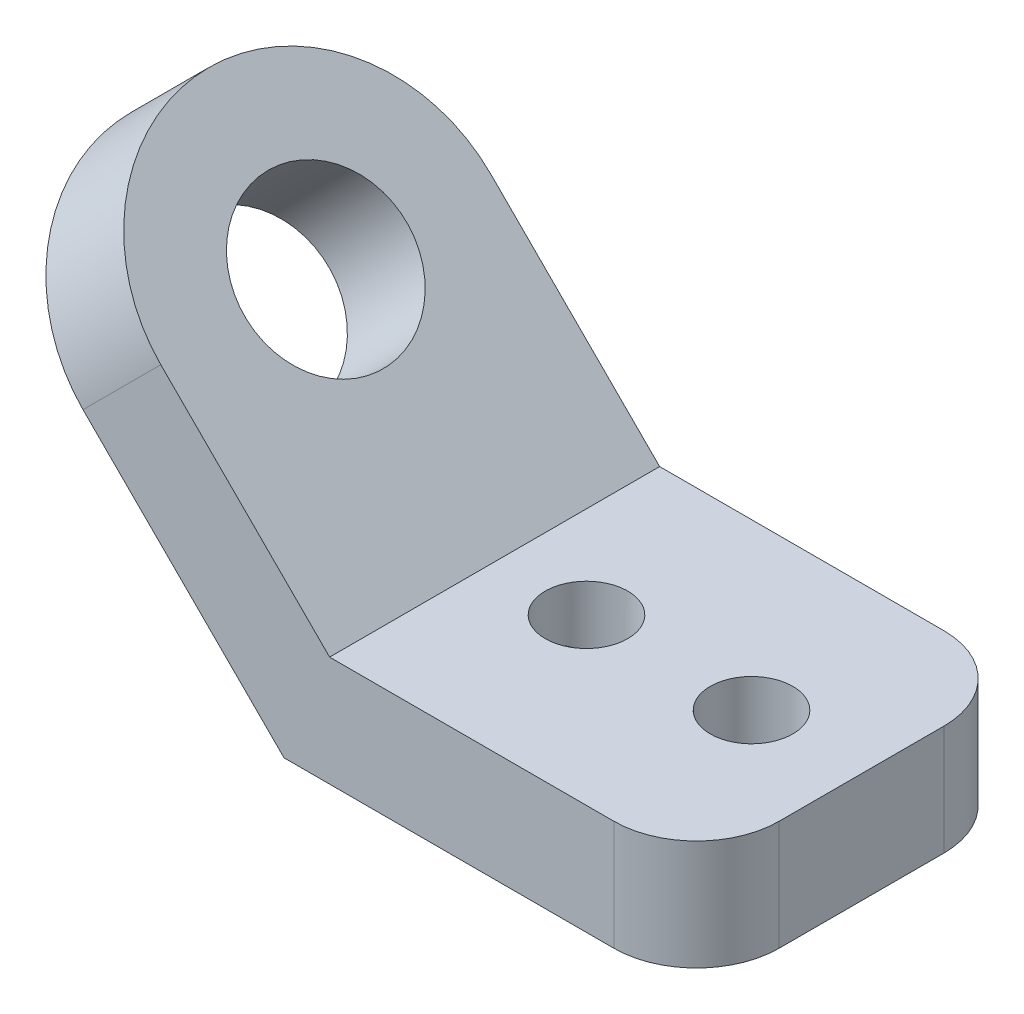
ISO-10303-21;
HEADER;
FILE_DESCRIPTION(('STEP AP214'),'2;1');
FILE_NAME('part.step','',(''),(''),'','','');
FILE_SCHEMA(('AUTOMOTIVE_DESIGN { 1 0 10303 214 1 1 1 1 }'));
ENDSEC;
DATA;
#1=APPLICATION_CONTEXT('core data for automotive mechanical design processes');
#2=APPLICATION_PROTOCOL_DEFINITION('international standard','automotive_design',2000,#1);
#3=PRODUCT_CONTEXT('',#1,'mechanical');
#4=PRODUCT('Part','Part','',(#3));
#5=PRODUCT_RELATED_PRODUCT_CATEGORY('part','',(#4));
#6=PRODUCT_DEFINITION_FORMATION('','',#4);
#7=PRODUCT_DEFINITION_CONTEXT('part definition',#1,'design');
#8=PRODUCT_DEFINITION('design','',#6,#7);
#9=PRODUCT_DEFINITION_SHAPE('','',#8);
#10=(LENGTH_UNIT() NAMED_UNIT(*) SI_UNIT(.MILLI.,.METRE.));
#11=(NAMED_UNIT(*) PLANE_ANGLE_UNIT() SI_UNIT($,.RADIAN.));
#12=(NAMED_UNIT(*) SI_UNIT($,.STERADIAN.) SOLID_ANGLE_UNIT());
#13=UNCERTAINTY_MEASURE_WITH_UNIT(LENGTH_MEASURE(1.E-05),#10,'distance_accuracy_value','');
#14=(GEOMETRIC_REPRESENTATION_CONTEXT(3) GLOBAL_UNCERTAINTY_ASSIGNED_CONTEXT((#13)) GLOBAL_UNIT_ASSIGNED_CONTEXT((#10,
#11,#12)) REPRESENTATION_CONTEXT('',''));
#15=CARTESIAN_POINT('',(0.,0.,0.));
#16=DIRECTION('',(0.,0.,1.));
#17=DIRECTION('',(1.,0.,0.));
#18=AXIS2_PLACEMENT_3D('',#15,#16,#17);
#19=CARTESIAN_POINT('',(-0.915,2.,0.));
#20=DIRECTION('',(0.,-1.,0.));
#21=DIRECTION('',(0.,0.,-1.));
#22=AXIS2_PLACEMENT_3D('',#19,#20,#21);
#23=CYLINDRICAL_SURFACE('',#22,0.750000000000001);
#24=CARTESIAN_POINT('',(-0.915,2.,0.));
#25=DIRECTION('',(0.,1.,0.));
#26=DIRECTION('',(0.,0.,1.));
#27=AXIS2_PLACEMENT_3D('',#24,#25,#26);
#28=CIRCLE('',#27,0.750000000000001);
#29=CARTESIAN_POINT('',(-0.915,2.,0.750000000000001));
#30=VERTEX_POINT('',#29);
#31=EDGE_CURVE('E166',#30,#30,#28,.T.);
#32=ORIENTED_EDGE('',*,*,#31,.T.);
#33=EDGE_LOOP('',(#32));
#34=FACE_BOUND('',#33,.T.);
#35=CARTESIAN_POINT('',(-0.915,0.,0.));
#36=DIRECTION('',(0.,1.,0.));
#37=DIRECTION('',(0.,0.,1.));
#38=AXIS2_PLACEMENT_3D('',#35,#36,#37);
#39=CIRCLE('',#38,0.750000000000001);
#40=CARTESIAN_POINT('',(-0.584999999999978,0.,0.673498329619299));
#41=VERTEX_POINT('',#40);
#42=CARTESIAN_POINT('',(-0.584999999999978,0.,-0.673498329619299));
#43=VERTEX_POINT('',#42);
#44=EDGE_CURVE('E163',#41,#43,#39,.T.);
#45=ORIENTED_EDGE('',*,*,#44,.F.);
#46=CARTESIAN_POINT('',(-0.915,0.33000000000002,0.));
#47=DIRECTION('',(-0.707106781186544,-0.707106781186551,0.));
#48=DIRECTION('',(0.707106781186551,-0.707106781186544,0.));
#49=AXIS2_PLACEMENT_3D('',#46,#47,#48);
#50=ELLIPSE('',#49,1.06066017177982,0.750000000000001);
#51=EDGE_CURVE('E11',#41,#43,#50,.T.);
#52=ORIENTED_EDGE('',*,*,#51,.T.);
#53=EDGE_LOOP('',(#45,#52));
#54=FACE_BOUND('',#53,.T.);
#55=ADVANCED_FACE('F37',(#34,#54),#23,.F.);
#56=CARTESIAN_POINT('',(2.585,2.,1.5));
#57=DIRECTION('',(0.,-1.,0.));
#58=DIRECTION('',(0.,0.,-1.));
#59=AXIS2_PLACEMENT_3D('',#56,#57,#58);
#60=PLANE('',#59);
#61=DIRECTION('',(0.,0.,1.));
#62=VECTOR('',#61,1.);
#63=CARTESIAN_POINT('',(-2.585,2.,-3.));
#64=LINE('',#63,#62);
#65=CARTESIAN_POINT('',(-2.585,2.,-3.));
#66=VERTEX_POINT('',#65);
#67=CARTESIAN_POINT('',(-2.585,2.,3.));
#68=VERTEX_POINT('',#67);
#69=EDGE_CURVE('E171',#66,#68,#64,.T.);
#70=ORIENTED_EDGE('',*,*,#69,.T.);
#71=DIRECTION('',(1.,0.,0.));
#72=VECTOR('',#71,1.);
#73=CARTESIAN_POINT('',(2.585,2.,3.));
#74=LINE('',#73,#72);
#75=CARTESIAN_POINT('',(2.585,2.,3.));
#76=VERTEX_POINT('',#75);
#77=EDGE_CURVE('E88',#68,#76,#74,.T.);
#78=ORIENTED_EDGE('',*,*,#77,.T.);
#79=CARTESIAN_POINT('',(2.585,2.,1.5));
#80=DIRECTION('',(0.,1.,0.));
#81=DIRECTION('',(0.,0.,-1.));
#82=AXIS2_PLACEMENT_3D('',#79,#80,#81);
#83=CIRCLE('',#82,1.5);
#84=CARTESIAN_POINT('',(4.085,2.,1.5));
#85=VERTEX_POINT('',#84);
#86=EDGE_CURVE('E174',#76,#85,#83,.T.);
#87=ORIENTED_EDGE('',*,*,#86,.T.);
#88=DIRECTION('',(0.,0.,-1.));
#89=VECTOR('',#88,1.);
#90=CARTESIAN_POINT('',(4.085,2.,-1.5));
#91=LINE('',#90,#89);
#92=CARTESIAN_POINT('',(4.085,2.,-1.5));
#93=VERTEX_POINT('',#92);
#94=EDGE_CURVE('E176',#85,#93,#91,.T.);
#95=ORIENTED_EDGE('',*,*,#94,.T.);
#96=CARTESIAN_POINT('',(2.585,2.,-1.5));
#97=DIRECTION('',(0.,1.,0.));
#98=DIRECTION('',(0.,0.,-1.));
#99=AXIS2_PLACEMENT_3D('',#96,#97,#98);
#100=CIRCLE('',#99,1.5);
#101=CARTESIAN_POINT('',(2.585,2.,-3.));
#102=VERTEX_POINT('',#101);
#103=EDGE_CURVE('E60',#93,#102,#100,.T.);
#104=ORIENTED_EDGE('',*,*,#103,.T.);
#105=DIRECTION('',(-1.,0.,0.));
#106=VECTOR('',#105,1.);
#107=CARTESIAN_POINT('',(-2.585,2.,-3.));
#108=LINE('',#107,#106);
#109=EDGE_CURVE('E179',#102,#66,#108,.T.);
#110=ORIENTED_EDGE('',*,*,#109,.T.);
#111=EDGE_LOOP('',(#70,#78,#87,#95,#104,#110));
#112=FACE_BOUND('',#111,.T.);
#113=ORIENTED_EDGE('',*,*,#31,.F.);
#114=EDGE_LOOP('',(#113));
#115=FACE_BOUND('',#114,.T.);
#116=CARTESIAN_POINT('',(2.085,2.,0.));
#117=DIRECTION('',(0.,1.,0.));
#118=DIRECTION('',(0.,0.,1.));
#119=AXIS2_PLACEMENT_3D('',#116,#117,#118);
#120=CIRCLE('',#119,0.749999999999998);
#121=CARTESIAN_POINT('',(2.085,2.,0.749999999999998));
#122=VERTEX_POINT('',#121);
#123=EDGE_CURVE('E160',#122,#122,#120,.T.);
#124=ORIENTED_EDGE('',*,*,#123,.F.);
#125=EDGE_LOOP('',(#124));
#126=FACE_BOUND('',#125,.T.);
#127=ADVANCED_FACE('F212',(#112,#115,#126),#60,.F.);
#128=CARTESIAN_POINT('',(2.585,0.,1.5));
#129=DIRECTION('',(0.,-1.,0.));
#130=DIRECTION('',(0.,0.,-1.));
#131=AXIS2_PLACEMENT_3D('',#128,#129,#130);
#132=PLANE('',#131);
#133=DIRECTION('',(0.,0.,1.));
#134=VECTOR('',#133,1.);
#135=CARTESIAN_POINT('',(-0.584999999999978,0.,3.));
#136=LINE('',#135,#134);
#137=EDGE_CURVE('E51',#43,#41,#136,.T.);
#138=ORIENTED_EDGE('',*,*,#137,.T.);
#139=ORIENTED_EDGE('',*,*,#44,.T.);
#140=EDGE_LOOP('',(#138,#139));
#141=FACE_BOUND('',#140,.T.);
#142=CARTESIAN_POINT('',(2.585,0.,1.5));
#143=DIRECTION('',(0.,1.,0.));
#144=DIRECTION('',(0.,0.,-1.));
#145=AXIS2_PLACEMENT_3D('',#142,#143,#144);
#146=CIRCLE('',#145,1.5);
#147=CARTESIAN_POINT('',(2.585,0.,3.));
#148=VERTEX_POINT('',#147);
#149=CARTESIAN_POINT('',(4.085,0.,1.5));
#150=VERTEX_POINT('',#149);
#151=EDGE_CURVE('E183',#148,#150,#146,.T.);
#152=ORIENTED_EDGE('',*,*,#151,.F.);
#153=DIRECTION('',(1.,0.,0.));
#154=VECTOR('',#153,1.);
#155=CARTESIAN_POINT('',(2.585,0.,3.));
#156=LINE('',#155,#154);
#157=CARTESIAN_POINT('',(-3.41342712474618,0.,3.));
#158=VERTEX_POINT('',#157);
#159=EDGE_CURVE('E169',#158,#148,#156,.T.);
#160=ORIENTED_EDGE('',*,*,#159,.F.);
#161=DIRECTION('',(0.,0.,-1.));
#162=VECTOR('',#161,1.);
#163=CARTESIAN_POINT('',(-3.41342712474618,0.,3.));
#164=LINE('',#163,#162);
#165=CARTESIAN_POINT('',(-3.41342712474618,0.,-3.));
#166=VERTEX_POINT('',#165);
#167=EDGE_CURVE('E155',#158,#166,#164,.T.);
#168=ORIENTED_EDGE('',*,*,#167,.T.);
#169=DIRECTION('',(-1.,0.,0.));
#170=VECTOR('',#169,1.);
#171=CARTESIAN_POINT('',(-2.585,0.,-3.));
#172=LINE('',#171,#170);
#173=CARTESIAN_POINT('',(2.585,0.,-3.));
#174=VERTEX_POINT('',#173);
#175=EDGE_CURVE('E123',#174,#166,#172,.T.);
#176=ORIENTED_EDGE('',*,*,#175,.F.);
#177=CARTESIAN_POINT('',(2.585,0.,-1.5));
#178=DIRECTION('',(0.,1.,0.));
#179=DIRECTION('',(0.,0.,-1.));
#180=AXIS2_PLACEMENT_3D('',#177,#178,#179);
#181=CIRCLE('',#180,1.5);
#182=CARTESIAN_POINT('',(4.085,0.,-1.5));
#183=VERTEX_POINT('',#182);
#184=EDGE_CURVE('E81',#183,#174,#181,.T.);
#185=ORIENTED_EDGE('',*,*,#184,.F.);
#186=DIRECTION('',(0.,0.,-1.));
#187=VECTOR('',#186,1.);
#188=CARTESIAN_POINT('',(4.085,0.,-1.5));
#189=LINE('',#188,#187);
#190=EDGE_CURVE('E185',#150,#183,#189,.T.);
#191=ORIENTED_EDGE('',*,*,#190,.F.);
#192=EDGE_LOOP('',(#152,#160,#168,#176,#185,#191));
#193=FACE_BOUND('',#192,.T.);
#194=CARTESIAN_POINT('',(2.085,0.,0.));
#195=DIRECTION('',(0.,1.,0.));
#196=DIRECTION('',(0.,0.,1.));
#197=AXIS2_PLACEMENT_3D('',#194,#195,#196);
#198=CIRCLE('',#197,0.749999999999998);
#199=CARTESIAN_POINT('',(2.085,0.,0.749999999999998));
#200=VERTEX_POINT('',#199);
#201=EDGE_CURVE('E157',#200,#200,#198,.T.);
#202=ORIENTED_EDGE('',*,*,#201,.T.);
#203=EDGE_LOOP('',(#202));
#204=FACE_BOUND('',#203,.T.);
#205=ADVANCED_FACE('F203',(#141,#193,#204),#132,.T.);
#206=CARTESIAN_POINT('',(2.585,2.,3.));
#207=DIRECTION('',(0.,0.,-1.));
#208=DIRECTION('',(-1.,0.,0.));
#209=AXIS2_PLACEMENT_3D('',#206,#207,#208);
#210=PLANE('',#209);
#211=ORIENTED_EDGE('',*,*,#159,.T.);
#212=DIRECTION('',(0.,-1.,0.));
#213=VECTOR('',#212,1.);
#214=CARTESIAN_POINT('',(2.585,2.,3.));
#215=LINE('',#214,#213);
#216=EDGE_CURVE('E45',#76,#148,#215,.T.);
#217=ORIENTED_EDGE('',*,*,#216,.F.);
#218=ORIENTED_EDGE('',*,*,#77,.F.);
#219=DIRECTION('',(0.707106781186551,-0.707106781186544,0.));
#220=VECTOR('',#219,1.);
#221=CARTESIAN_POINT('',(-2.585,2.,3.));
#222=LINE('',#221,#220);
#223=CARTESIAN_POINT('',(-5.65384343034963,5.0688434303496,3.));
#224=VERTEX_POINT('',#223);
#225=EDGE_CURVE('E143',#224,#68,#222,.T.);
#226=ORIENTED_EDGE('',*,*,#225,.F.);
#227=DIRECTION('',(0.707106781186544,0.707106781186551,0.));
#228=VECTOR('',#227,1.);
#229=CARTESIAN_POINT('',(-7.06805699272272,3.6546298679765,3.));
#230=LINE('',#229,#228);
#231=CARTESIAN_POINT('',(-7.06805699272272,3.6546298679765,3.));
#232=VERTEX_POINT('',#231);
#233=EDGE_CURVE('E137',#232,#224,#230,.T.);
#234=ORIENTED_EDGE('',*,*,#233,.F.);
#235=DIRECTION('',(-0.707106781186551,0.707106781186544,0.));
#236=VECTOR('',#235,1.);
#237=CARTESIAN_POINT('',(2.69202529410859,-6.10545241885471,3.));
#238=LINE('',#237,#236);
#239=EDGE_CURVE('E128',#158,#232,#238,.T.);
#240=ORIENTED_EDGE('',*,*,#239,.F.);
#241=EDGE_LOOP('',(#211,#217,#218,#226,#234,#240));
#242=FACE_BOUND('',#241,.T.);
#243=ADVANCED_FACE('F39',(#242),#210,.F.);
#244=CARTESIAN_POINT('',(2.585,2.,1.5));
#245=DIRECTION('',(0.,-1.,0.));
#246=DIRECTION('',(0.,0.,-1.));
#247=AXIS2_PLACEMENT_3D('',#244,#245,#246);
#248=CYLINDRICAL_SURFACE('',#247,1.5);
#249=ORIENTED_EDGE('',*,*,#151,.T.);
#250=DIRECTION('',(0.,-1.,0.));
#251=VECTOR('',#250,1.);
#252=CARTESIAN_POINT('',(4.085,2.,1.5));
#253=LINE('',#252,#251);
#254=EDGE_CURVE('E192',#85,#150,#253,.T.);
#255=ORIENTED_EDGE('',*,*,#254,.F.);
#256=ORIENTED_EDGE('',*,*,#86,.F.);
#257=ORIENTED_EDGE('',*,*,#216,.T.);
#258=EDGE_LOOP('',(#249,#255,#256,#257));
#259=FACE_BOUND('',#258,.T.);
#260=ADVANCED_FACE('F198',(#259),#248,.T.);
#261=CARTESIAN_POINT('',(4.085,2.,-1.5));
#262=DIRECTION('',(-1.,0.,0.));
#263=DIRECTION('',(0.,0.,1.));
#264=AXIS2_PLACEMENT_3D('',#261,#262,#263);
#265=PLANE('',#264);
#266=ORIENTED_EDGE('',*,*,#190,.T.);
#267=DIRECTION('',(0.,-1.,0.));
#268=VECTOR('',#267,1.);
#269=CARTESIAN_POINT('',(4.085,2.,-1.5));
#270=LINE('',#269,#268);
#271=EDGE_CURVE('E190',#93,#183,#270,.T.);
#272=ORIENTED_EDGE('',*,*,#271,.F.);
#273=ORIENTED_EDGE('',*,*,#94,.F.);
#274=ORIENTED_EDGE('',*,*,#254,.T.);
#275=EDGE_LOOP('',(#266,#272,#273,#274));
#276=FACE_BOUND('',#275,.T.);
#277=ADVANCED_FACE('F207',(#276),#265,.F.);
#278=CARTESIAN_POINT('',(2.585,2.,-1.5));
#279=DIRECTION('',(0.,-1.,0.));
#280=DIRECTION('',(0.,0.,-1.));
#281=AXIS2_PLACEMENT_3D('',#278,#279,#280);
#282=CYLINDRICAL_SURFACE('',#281,1.5);
#283=ORIENTED_EDGE('',*,*,#184,.T.);
#284=DIRECTION('',(0.,-1.,0.));
#285=VECTOR('',#284,1.);
#286=CARTESIAN_POINT('',(2.585,2.,-3.));
#287=LINE('',#286,#285);
#288=EDGE_CURVE('E181',#102,#174,#287,.T.);
#289=ORIENTED_EDGE('',*,*,#288,.F.);
#290=ORIENTED_EDGE('',*,*,#103,.F.);
#291=ORIENTED_EDGE('',*,*,#271,.T.);
#292=EDGE_LOOP('',(#283,#289,#290,#291));
#293=FACE_BOUND('',#292,.T.);
#294=ADVANCED_FACE('F209',(#293),#282,.T.);
#295=CARTESIAN_POINT('',(-2.585,2.,-3.));
#296=DIRECTION('',(0.,0.,1.));
#297=DIRECTION('',(1.,0.,0.));
#298=AXIS2_PLACEMENT_3D('',#295,#296,#297);
#299=PLANE('',#298);
#300=ORIENTED_EDGE('',*,*,#175,.T.);
#301=DIRECTION('',(-0.707106781186551,0.707106781186544,0.));
#302=VECTOR('',#301,1.);
#303=CARTESIAN_POINT('',(2.69202529410859,-6.10545241885471,-3.));
#304=LINE('',#303,#302);
#305=CARTESIAN_POINT('',(-7.06805699272272,3.6546298679765,-3.));
#306=VERTEX_POINT('',#305);
#307=EDGE_CURVE('E117',#166,#306,#304,.T.);
#308=ORIENTED_EDGE('',*,*,#307,.T.);
#309=DIRECTION('',(0.707106781186544,0.707106781186551,0.));
#310=VECTOR('',#309,1.);
#311=CARTESIAN_POINT('',(-7.06805699272272,3.6546298679765,-3.));
#312=LINE('',#311,#310);
#313=CARTESIAN_POINT('',(-5.65384343034963,5.0688434303496,-3.));
#314=VERTEX_POINT('',#313);
#315=EDGE_CURVE('E120',#306,#314,#312,.T.);
#316=ORIENTED_EDGE('',*,*,#315,.T.);
#317=DIRECTION('',(-0.707106781186551,0.707106781186544,0.));
#318=VECTOR('',#317,1.);
#319=CARTESIAN_POINT('',(-2.585,2.,-3.));
#320=LINE('',#319,#318);
#321=EDGE_CURVE('E150',#66,#314,#320,.T.);
#322=ORIENTED_EDGE('',*,*,#321,.F.);
#323=ORIENTED_EDGE('',*,*,#109,.F.);
#324=ORIENTED_EDGE('',*,*,#288,.T.);
#325=EDGE_LOOP('',(#300,#308,#316,#322,#323,#324));
#326=FACE_BOUND('',#325,.T.);
#327=ADVANCED_FACE('F119',(#326),#299,.F.);
#328=CARTESIAN_POINT('',(2.085,2.,0.));
#329=DIRECTION('',(0.,-1.,0.));
#330=DIRECTION('',(0.,0.,-1.));
#331=AXIS2_PLACEMENT_3D('',#328,#329,#330);
#332=CYLINDRICAL_SURFACE('',#331,0.749999999999998);
#333=ORIENTED_EDGE('',*,*,#123,.T.);
#334=EDGE_LOOP('',(#333));
#335=FACE_BOUND('',#334,.T.);
#336=ORIENTED_EDGE('',*,*,#201,.F.);
#337=EDGE_LOOP('',(#336));
#338=FACE_BOUND('',#337,.T.);
#339=ADVANCED_FACE('F232',(#335,#338),#332,.F.);
#340=CARTESIAN_POINT('',(4.10623885648168,-4.69123885648161,3.));
#341=DIRECTION('',(-0.707106781186544,-0.707106781186551,0.));
#342=DIRECTION('',(0.707106781186551,-0.707106781186544,0.));
#343=AXIS2_PLACEMENT_3D('',#340,#341,#342);
#344=PLANE('',#343);
#345=ORIENTED_EDGE('',*,*,#51,.F.);
#346=ORIENTED_EDGE('',*,*,#137,.F.);
#347=EDGE_LOOP('',(#345,#346));
#348=FACE_BOUND('',#347,.T.);
#349=ADVANCED_FACE('F259',(#348),#344,.F.);
#350=CARTESIAN_POINT('',(2.69202529410859,-6.10545241885471,3.));
#351=DIRECTION('',(0.707106781186544,0.707106781186551,0.));
#352=DIRECTION('',(-0.707106781186551,0.707106781186544,0.));
#353=AXIS2_PLACEMENT_3D('',#350,#351,#352);
#354=PLANE('',#353);
#355=ORIENTED_EDGE('',*,*,#167,.F.);
#356=ORIENTED_EDGE('',*,*,#239,.T.);
#357=CARTESIAN_POINT('',(-7.06805699272272,3.6546298679765,0.));
#358=DIRECTION('',(0.707106781186544,0.707106781186551,0.));
#359=DIRECTION('',(-0.707106781186551,0.707106781186544,0.));
#360=AXIS2_PLACEMENT_3D('',#357,#358,#359);
#361=CIRCLE('',#360,3.);
#362=EDGE_CURVE('E133',#306,#232,#361,.T.);
#363=ORIENTED_EDGE('',*,*,#362,.F.);
#364=ORIENTED_EDGE('',*,*,#307,.F.);
#365=EDGE_LOOP('',(#355,#356,#363,#364));
#366=FACE_BOUND('',#365,.T.);
#367=CARTESIAN_POINT('',(-7.06805699272272,3.6546298679765,0.));
#368=DIRECTION('',(0.707106781186544,0.707106781186551,0.));
#369=DIRECTION('',(-0.707106781186551,0.707106781186544,0.));
#370=AXIS2_PLACEMENT_3D('',#367,#368,#369);
#371=CIRCLE('',#370,1.475);
#372=CARTESIAN_POINT('',(-8.11103949497288,4.69761237022665,0.));
#373=VERTEX_POINT('',#372);
#374=EDGE_CURVE('E152',#373,#373,#371,.T.);
#375=ORIENTED_EDGE('',*,*,#374,.T.);
#376=EDGE_LOOP('',(#375));
#377=FACE_BOUND('',#376,.T.);
#378=ADVANCED_FACE('F139',(#366,#377),#354,.F.);
#379=CARTESIAN_POINT('',(-7.06805699272272,3.6546298679765,0.));
#380=DIRECTION('',(0.707106781186544,0.707106781186551,0.));
#381=DIRECTION('',(-0.707106781186551,0.707106781186544,0.));
#382=AXIS2_PLACEMENT_3D('',#379,#380,#381);
#383=CYLINDRICAL_SURFACE('',#382,3.);
#384=CARTESIAN_POINT('',(-5.65384343034963,5.0688434303496,0.));
#385=DIRECTION('',(0.707106781186544,0.707106781186551,0.));
#386=DIRECTION('',(-0.707106781186551,0.707106781186544,0.));
#387=AXIS2_PLACEMENT_3D('',#384,#385,#386);
#388=CIRCLE('',#387,3.);
#389=EDGE_CURVE('E135',#314,#224,#388,.T.);
#390=ORIENTED_EDGE('',*,*,#389,.F.);
#391=ORIENTED_EDGE('',*,*,#315,.F.);
#392=ORIENTED_EDGE('',*,*,#362,.T.);
#393=ORIENTED_EDGE('',*,*,#233,.T.);
#394=EDGE_LOOP('',(#390,#391,#392,#393));
#395=FACE_BOUND('',#394,.T.);
#396=ADVANCED_FACE('F132',(#395),#383,.T.);
#397=CARTESIAN_POINT('',(-5.65384343034963,5.0688434303496,0.));
#398=DIRECTION('',(0.707106781186544,0.707106781186551,0.));
#399=DIRECTION('',(-0.707106781186551,0.707106781186544,0.));
#400=AXIS2_PLACEMENT_3D('',#397,#398,#399);
#401=PLANE('',#400);
#402=CARTESIAN_POINT('',(-5.65384343034963,5.0688434303496,0.));
#403=DIRECTION('',(0.707106781186544,0.707106781186551,0.));
#404=DIRECTION('',(-0.707106781186551,0.707106781186544,0.));
#405=AXIS2_PLACEMENT_3D('',#402,#403,#404);
#406=CIRCLE('',#405,1.475);
#407=CARTESIAN_POINT('',(-6.6968259325998,6.11182593259975,0.));
#408=VERTEX_POINT('',#407);
#409=EDGE_CURVE('E148',#408,#408,#406,.T.);
#410=ORIENTED_EDGE('',*,*,#409,.F.);
#411=EDGE_LOOP('',(#410));
#412=FACE_BOUND('',#411,.T.);
#413=ORIENTED_EDGE('',*,*,#321,.T.);
#414=ORIENTED_EDGE('',*,*,#389,.T.);
#415=ORIENTED_EDGE('',*,*,#225,.T.);
#416=ORIENTED_EDGE('',*,*,#69,.F.);
#417=EDGE_LOOP('',(#413,#414,#415,#416));
#418=FACE_BOUND('',#417,.T.);
#419=ADVANCED_FACE('F215',(#412,#418),#401,.T.);
#420=CARTESIAN_POINT('',(-7.06805699272272,3.6546298679765,0.));
#421=DIRECTION('',(0.707106781186544,0.707106781186551,0.));
#422=DIRECTION('',(-0.707106781186551,0.707106781186544,0.));
#423=AXIS2_PLACEMENT_3D('',#420,#421,#422);
#424=CYLINDRICAL_SURFACE('',#423,1.475);
#425=ORIENTED_EDGE('',*,*,#374,.F.);
#426=EDGE_LOOP('',(#425));
#427=FACE_BOUND('',#426,.T.);
#428=ORIENTED_EDGE('',*,*,#409,.T.);
#429=EDGE_LOOP('',(#428));
#430=FACE_BOUND('',#429,.T.);
#431=ADVANCED_FACE('F283',(#427,#430),#424,.F.);
#432=CLOSED_SHELL('',(#55,#127,#205,#243,#260,#277,#294,#327,#339,#349,#378,#396,#419,#431));
#433=MANIFOLD_SOLID_BREP('B2',#432);
#434=ADVANCED_BREP_SHAPE_REPRESENTATION('',(#18,#433),#14);
#435=SHAPE_DEFINITION_REPRESENTATION(#9,#434);
ENDSEC;
END-ISO-10303-21;
